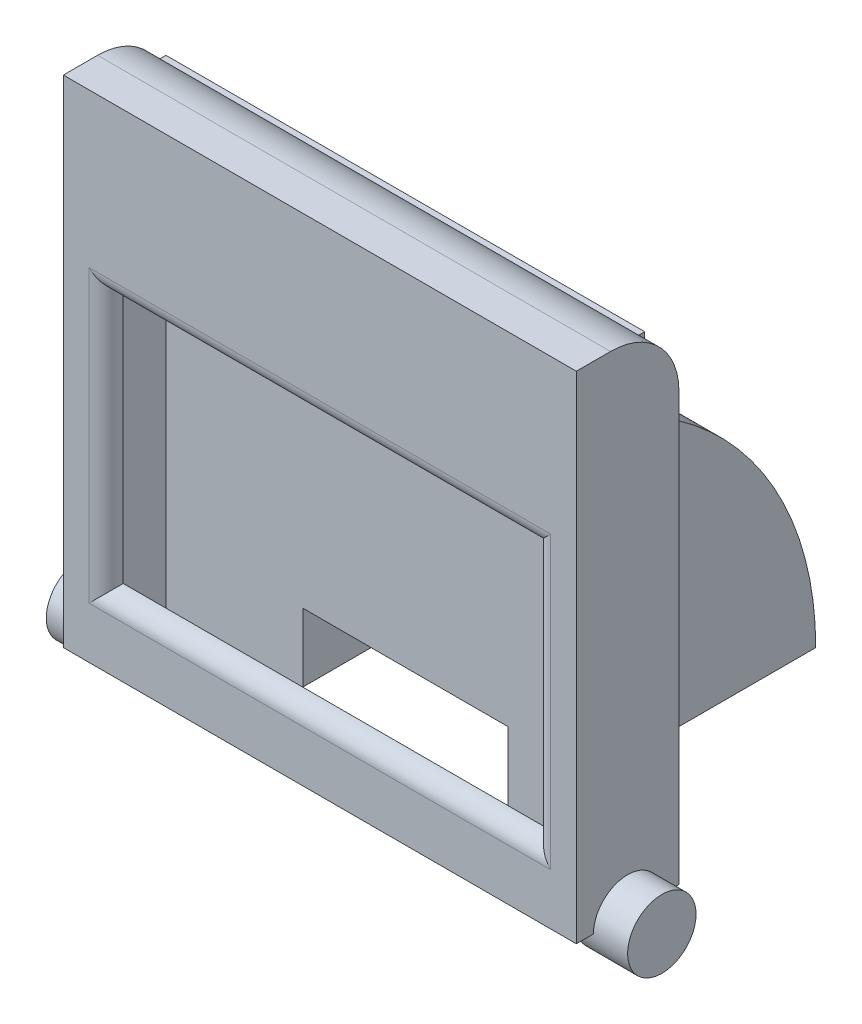
ISO-10303-21;
HEADER;
FILE_DESCRIPTION(('STEP AP214'),'2;1');
FILE_NAME('part.step','',(''),(''),'','','');
FILE_SCHEMA(('AUTOMOTIVE_DESIGN { 1 0 10303 214 1 1 1 1 }'));
ENDSEC;
DATA;
#1=APPLICATION_CONTEXT('core data for automotive mechanical design processes');
#2=APPLICATION_PROTOCOL_DEFINITION('international standard','automotive_design',2000,#1);
#3=PRODUCT_CONTEXT('',#1,'mechanical');
#4=PRODUCT('Part','Part','',(#3));
#5=PRODUCT_RELATED_PRODUCT_CATEGORY('part','',(#4));
#6=PRODUCT_DEFINITION_FORMATION('','',#4);
#7=PRODUCT_DEFINITION_CONTEXT('part definition',#1,'design');
#8=PRODUCT_DEFINITION('design','',#6,#7);
#9=PRODUCT_DEFINITION_SHAPE('','',#8);
#10=(LENGTH_UNIT() NAMED_UNIT(*) SI_UNIT(.MILLI.,.METRE.));
#11=(NAMED_UNIT(*) PLANE_ANGLE_UNIT() SI_UNIT($,.RADIAN.));
#12=(NAMED_UNIT(*) SI_UNIT($,.STERADIAN.) SOLID_ANGLE_UNIT());
#13=UNCERTAINTY_MEASURE_WITH_UNIT(LENGTH_MEASURE(1.E-05),#10,'distance_accuracy_value','');
#14=(GEOMETRIC_REPRESENTATION_CONTEXT(3) GLOBAL_UNCERTAINTY_ASSIGNED_CONTEXT((#13)) GLOBAL_UNIT_ASSIGNED_CONTEXT((#10,
#11,#12)) REPRESENTATION_CONTEXT('',''));
#15=CARTESIAN_POINT('',(0.,0.,0.));
#16=DIRECTION('',(0.,0.,1.));
#17=DIRECTION('',(1.,0.,0.));
#18=AXIS2_PLACEMENT_3D('',#15,#16,#17);
#19=CARTESIAN_POINT('',(0.,0.,4.));
#20=DIRECTION('',(0.,1.,0.));
#21=DIRECTION('',(0.,0.,1.));
#22=AXIS2_PLACEMENT_3D('',#19,#20,#21);
#23=PLANE('',#22);
#24=DIRECTION('',(1.,0.,0.));
#25=VECTOR('',#24,1.);
#26=CARTESIAN_POINT('',(0.,0.,0.));
#27=LINE('',#26,#25);
#28=CARTESIAN_POINT('',(0.,0.,0.));
#29=VERTEX_POINT('',#28);
#30=CARTESIAN_POINT('',(8.,0.,0.));
#31=VERTEX_POINT('',#30);
#32=EDGE_CURVE('E228',#29,#31,#27,.T.);
#33=ORIENTED_EDGE('',*,*,#32,.F.);
#34=DIRECTION('',(-1.,0.,0.));
#35=VECTOR('',#34,1.);
#36=CARTESIAN_POINT('',(0.,0.,0.));
#37=LINE('',#36,#35);
#38=CARTESIAN_POINT('',(-1.,0.,0.));
#39=VERTEX_POINT('',#38);
#40=EDGE_CURVE('E187',#29,#39,#37,.T.);
#41=ORIENTED_EDGE('',*,*,#40,.T.);
#42=DIRECTION('',(0.,0.,-1.));
#43=VECTOR('',#42,1.);
#44=CARTESIAN_POINT('',(-1.,0.,4.));
#45=LINE('',#44,#43);
#46=CARTESIAN_POINT('',(-1.,0.,-1.));
#47=VERTEX_POINT('',#46);
#48=EDGE_CURVE('E263',#39,#47,#45,.T.);
#49=ORIENTED_EDGE('',*,*,#48,.T.);
#50=DIRECTION('',(1.,0.,0.));
#51=VECTOR('',#50,1.);
#52=CARTESIAN_POINT('',(0.,0.,-1.));
#53=LINE('',#52,#51);
#54=CARTESIAN_POINT('',(7.,0.,-1.));
#55=VERTEX_POINT('',#54);
#56=EDGE_CURVE('E259',#47,#55,#53,.T.);
#57=ORIENTED_EDGE('',*,*,#56,.T.);
#58=DIRECTION('',(0.,0.,-1.));
#59=VECTOR('',#58,1.);
#60=CARTESIAN_POINT('',(7.,0.,-1.));
#61=LINE('',#60,#59);
#62=CARTESIAN_POINT('',(7.,0.,-17.));
#63=VERTEX_POINT('',#62);
#64=EDGE_CURVE('E370',#55,#63,#61,.T.);
#65=ORIENTED_EDGE('',*,*,#64,.T.);
#66=DIRECTION('',(-1.,0.,0.));
#67=VECTOR('',#66,1.);
#68=CARTESIAN_POINT('',(21.,0.,-17.));
#69=LINE('',#68,#67);
#70=CARTESIAN_POINT('',(21.,0.,-17.));
#71=VERTEX_POINT('',#70);
#72=EDGE_CURVE('E375',#71,#63,#69,.T.);
#73=ORIENTED_EDGE('',*,*,#72,.F.);
#74=DIRECTION('',(0.,0.,-1.));
#75=VECTOR('',#74,1.);
#76=CARTESIAN_POINT('',(21.,0.,-1.));
#77=LINE('',#76,#75);
#78=CARTESIAN_POINT('',(21.,0.,-1.));
#79=VERTEX_POINT('',#78);
#80=EDGE_CURVE('E362',#79,#71,#77,.T.);
#81=ORIENTED_EDGE('',*,*,#80,.F.);
#82=CARTESIAN_POINT('',(29.,0.,-1.));
#83=VERTEX_POINT('',#82);
#84=EDGE_CURVE('E241',#79,#83,#53,.T.);
#85=ORIENTED_EDGE('',*,*,#84,.T.);
#86=DIRECTION('',(0.,0.,-1.));
#87=VECTOR('',#86,1.);
#88=CARTESIAN_POINT('',(29.,0.,4.));
#89=LINE('',#88,#87);
#90=CARTESIAN_POINT('',(29.,0.,0.));
#91=VERTEX_POINT('',#90);
#92=EDGE_CURVE('E256',#91,#83,#89,.T.);
#93=ORIENTED_EDGE('',*,*,#92,.F.);
#94=DIRECTION('',(1.,0.,0.));
#95=VECTOR('',#94,1.);
#96=CARTESIAN_POINT('',(28.,0.,0.));
#97=LINE('',#96,#95);
#98=CARTESIAN_POINT('',(28.,0.,0.));
#99=VERTEX_POINT('',#98);
#100=EDGE_CURVE('E60',#91,#99,#97,.F.);
#101=ORIENTED_EDGE('',*,*,#100,.T.);
#102=CARTESIAN_POINT('',(20.,0.,0.));
#103=VERTEX_POINT('',#102);
#104=EDGE_CURVE('E226',#103,#99,#27,.T.);
#105=ORIENTED_EDGE('',*,*,#104,.F.);
#106=DIRECTION('',(0.,0.,-1.));
#107=VECTOR('',#106,1.);
#108=CARTESIAN_POINT('',(20.,0.,5.001));
#109=LINE('',#108,#107);
#110=CARTESIAN_POINT('',(20.,0.,-16.));
#111=VERTEX_POINT('',#110);
#112=EDGE_CURVE('E386',#103,#111,#109,.T.);
#113=ORIENTED_EDGE('',*,*,#112,.T.);
#114=DIRECTION('',(1.,0.,0.));
#115=VECTOR('',#114,1.);
#116=CARTESIAN_POINT('',(8.,0.,-16.));
#117=LINE('',#116,#115);
#118=CARTESIAN_POINT('',(8.,0.,-16.));
#119=VERTEX_POINT('',#118);
#120=EDGE_CURVE('E346',#119,#111,#117,.T.);
#121=ORIENTED_EDGE('',*,*,#120,.F.);
#122=DIRECTION('',(0.,0.,-1.));
#123=VECTOR('',#122,1.);
#124=CARTESIAN_POINT('',(8.,0.,5.001));
#125=LINE('',#124,#123);
#126=EDGE_CURVE('E390',#31,#119,#125,.T.);
#127=ORIENTED_EDGE('',*,*,#126,.F.);
#128=EDGE_LOOP('',(#33,#41,#49,#57,#65,#73,#81,#85,#93,#101,#105,#113,#121,#127));
#129=FACE_BOUND('',#128,.T.);
#130=ADVANCED_FACE('F35',(#129),#23,.F.);
#131=CARTESIAN_POINT('',(-1.,0.,5.));
#132=VERTEX_POINT('',#131);
#133=CARTESIAN_POINT('',(-1.,0.,4.));
#134=VERTEX_POINT('',#133);
#135=EDGE_CURVE('E203',#132,#134,#45,.T.);
#136=ORIENTED_EDGE('',*,*,#135,.T.);
#137=DIRECTION('',(-1.,0.,0.));
#138=VECTOR('',#137,1.);
#139=CARTESIAN_POINT('',(0.,0.,4.));
#140=LINE('',#139,#138);
#141=CARTESIAN_POINT('',(0.,0.,4.));
#142=VERTEX_POINT('',#141);
#143=EDGE_CURVE('E52',#134,#142,#140,.F.);
#144=ORIENTED_EDGE('',*,*,#143,.T.);
#145=DIRECTION('',(1.,0.,0.));
#146=VECTOR('',#145,1.);
#147=CARTESIAN_POINT('',(0.,0.,4.));
#148=LINE('',#147,#146);
#149=CARTESIAN_POINT('',(28.,0.,4.));
#150=VERTEX_POINT('',#149);
#151=EDGE_CURVE('E201',#142,#150,#148,.T.);
#152=ORIENTED_EDGE('',*,*,#151,.T.);
#153=DIRECTION('',(1.,0.,0.));
#154=VECTOR('',#153,1.);
#155=CARTESIAN_POINT('',(28.,0.,4.));
#156=LINE('',#155,#154);
#157=CARTESIAN_POINT('',(29.,0.,4.));
#158=VERTEX_POINT('',#157);
#159=EDGE_CURVE('E344',#150,#158,#156,.T.);
#160=ORIENTED_EDGE('',*,*,#159,.T.);
#161=CARTESIAN_POINT('',(29.,0.,5.));
#162=VERTEX_POINT('',#161);
#163=EDGE_CURVE('E266',#162,#158,#89,.T.);
#164=ORIENTED_EDGE('',*,*,#163,.F.);
#165=DIRECTION('',(1.,0.,0.));
#166=VECTOR('',#165,1.);
#167=CARTESIAN_POINT('',(0.,0.,5.));
#168=LINE('',#167,#166);
#169=EDGE_CURVE('E245',#132,#162,#168,.T.);
#170=ORIENTED_EDGE('',*,*,#169,.F.);
#171=EDGE_LOOP('',(#136,#144,#152,#160,#164,#170));
#172=FACE_BOUND('',#171,.T.);
#173=ADVANCED_FACE('F198',(#172),#23,.F.);
#174=CARTESIAN_POINT('',(-1.,0.,4.));
#175=DIRECTION('',(1.,0.,0.));
#176=DIRECTION('',(0.,0.,-1.));
#177=AXIS2_PLACEMENT_3D('',#174,#175,#176);
#178=PLANE('',#177);
#179=ORIENTED_EDGE('',*,*,#48,.F.);
#180=CARTESIAN_POINT('',(-1.,0.,2.));
#181=DIRECTION('',(1.,0.,0.));
#182=DIRECTION('',(0.,0.,-1.));
#183=AXIS2_PLACEMENT_3D('',#180,#181,#182);
#184=CIRCLE('',#183,2.);
#185=EDGE_CURVE('E192',#39,#134,#184,.T.);
#186=ORIENTED_EDGE('',*,*,#185,.T.);
#187=ORIENTED_EDGE('',*,*,#135,.F.);
#188=DIRECTION('',(0.,-1.,0.));
#189=VECTOR('',#188,1.);
#190=CARTESIAN_POINT('',(-1.,0.,5.));
#191=LINE('',#190,#189);
#192=CARTESIAN_POINT('',(-1.,29.,5.));
#193=VERTEX_POINT('',#192);
#194=EDGE_CURVE('E242',#193,#132,#191,.T.);
#195=ORIENTED_EDGE('',*,*,#194,.F.);
#196=DIRECTION('',(0.,0.,-1.));
#197=VECTOR('',#196,1.);
#198=CARTESIAN_POINT('',(-1.,29.,4.));
#199=LINE('',#198,#197);
#200=CARTESIAN_POINT('',(-1.,29.,3.));
#201=VERTEX_POINT('',#200);
#202=EDGE_CURVE('E247',#193,#201,#199,.T.);
#203=ORIENTED_EDGE('',*,*,#202,.T.);
#204=CARTESIAN_POINT('',(-1.,25.,3.));
#205=DIRECTION('',(1.,0.,0.));
#206=DIRECTION('',(0.,0.,-1.));
#207=AXIS2_PLACEMENT_3D('',#204,#205,#206);
#208=CIRCLE('',#207,4.);
#209=CARTESIAN_POINT('',(-1.,25.,-1.));
#210=VERTEX_POINT('',#209);
#211=EDGE_CURVE('E272',#201,#210,#208,.F.);
#212=ORIENTED_EDGE('',*,*,#211,.T.);
#213=DIRECTION('',(0.,-1.,0.));
#214=VECTOR('',#213,1.);
#215=CARTESIAN_POINT('',(-1.,0.,-1.));
#216=LINE('',#215,#214);
#217=EDGE_CURVE('E238',#210,#47,#216,.T.);
#218=ORIENTED_EDGE('',*,*,#217,.T.);
#219=EDGE_LOOP('',(#179,#186,#187,#195,#203,#212,#218));
#220=FACE_BOUND('',#219,.T.);
#221=ADVANCED_FACE('F331',(#220),#178,.F.);
#222=CARTESIAN_POINT('',(29.,0.,4.));
#223=DIRECTION('',(-1.,0.,0.));
#224=DIRECTION('',(0.,0.,1.));
#225=AXIS2_PLACEMENT_3D('',#222,#223,#224);
#226=PLANE('',#225);
#227=ORIENTED_EDGE('',*,*,#163,.T.);
#228=CARTESIAN_POINT('',(29.,0.,2.));
#229=DIRECTION('',(-1.,0.,0.));
#230=DIRECTION('',(0.,0.,1.));
#231=AXIS2_PLACEMENT_3D('',#228,#229,#230);
#232=CIRCLE('',#231,2.);
#233=EDGE_CURVE('E341',#158,#91,#232,.T.);
#234=ORIENTED_EDGE('',*,*,#233,.T.);
#235=ORIENTED_EDGE('',*,*,#92,.T.);
#236=DIRECTION('',(0.,1.,0.));
#237=VECTOR('',#236,1.);
#238=CARTESIAN_POINT('',(29.,0.,-1.));
#239=LINE('',#238,#237);
#240=CARTESIAN_POINT('',(29.,25.,-1.));
#241=VERTEX_POINT('',#240);
#242=EDGE_CURVE('E246',#83,#241,#239,.T.);
#243=ORIENTED_EDGE('',*,*,#242,.T.);
#244=CARTESIAN_POINT('',(29.,25.,3.));
#245=DIRECTION('',(-1.,0.,0.));
#246=DIRECTION('',(0.,0.,1.));
#247=AXIS2_PLACEMENT_3D('',#244,#245,#246);
#248=CIRCLE('',#247,4.);
#249=CARTESIAN_POINT('',(29.,29.,3.));
#250=VERTEX_POINT('',#249);
#251=EDGE_CURVE('E276',#241,#250,#248,.F.);
#252=ORIENTED_EDGE('',*,*,#251,.T.);
#253=DIRECTION('',(0.,0.,-1.));
#254=VECTOR('',#253,1.);
#255=CARTESIAN_POINT('',(29.,29.,4.));
#256=LINE('',#255,#254);
#257=CARTESIAN_POINT('',(29.,29.,5.));
#258=VERTEX_POINT('',#257);
#259=EDGE_CURVE('E250',#258,#250,#256,.T.);
#260=ORIENTED_EDGE('',*,*,#259,.F.);
#261=DIRECTION('',(0.,1.,0.));
#262=VECTOR('',#261,1.);
#263=CARTESIAN_POINT('',(29.,0.,5.));
#264=LINE('',#263,#262);
#265=EDGE_CURVE('E253',#162,#258,#264,.T.);
#266=ORIENTED_EDGE('',*,*,#265,.F.);
#267=EDGE_LOOP('',(#227,#234,#235,#243,#252,#260,#266));
#268=FACE_BOUND('',#267,.T.);
#269=ADVANCED_FACE('F444',(#268),#226,.F.);
#270=CARTESIAN_POINT('',(0.,29.,4.));
#271=DIRECTION('',(0.,-1.,0.));
#272=DIRECTION('',(0.,0.,-1.));
#273=AXIS2_PLACEMENT_3D('',#270,#271,#272);
#274=PLANE('',#273);
#275=ORIENTED_EDGE('',*,*,#259,.T.);
#276=DIRECTION('',(-1.,0.,0.));
#277=VECTOR('',#276,1.);
#278=CARTESIAN_POINT('',(-1.,29.,3.));
#279=LINE('',#278,#277);
#280=EDGE_CURVE('E262',#250,#201,#279,.T.);
#281=ORIENTED_EDGE('',*,*,#280,.T.);
#282=ORIENTED_EDGE('',*,*,#202,.F.);
#283=DIRECTION('',(-1.,0.,0.));
#284=VECTOR('',#283,1.);
#285=CARTESIAN_POINT('',(0.,29.,5.));
#286=LINE('',#285,#284);
#287=EDGE_CURVE('E251',#258,#193,#286,.T.);
#288=ORIENTED_EDGE('',*,*,#287,.F.);
#289=EDGE_LOOP('',(#275,#281,#282,#288));
#290=FACE_BOUND('',#289,.T.);
#291=ADVANCED_FACE('F323',(#290),#274,.F.);
#292=CARTESIAN_POINT('',(0.,0.,5.));
#293=DIRECTION('',(0.,0.,-1.));
#294=DIRECTION('',(-1.,0.,0.));
#295=AXIS2_PLACEMENT_3D('',#292,#293,#294);
#296=PLANE('',#295);
#297=DIRECTION('',(-1.,0.,0.));
#298=VECTOR('',#297,1.);
#299=CARTESIAN_POINT('',(0.,20.,5.));
#300=LINE('',#299,#298);
#301=CARTESIAN_POINT('',(0.499999999999998,20.,5.));
#302=VERTEX_POINT('',#301);
#303=CARTESIAN_POINT('',(27.5,20.,5.));
#304=VERTEX_POINT('',#303);
#305=EDGE_CURVE('E44',#302,#304,#300,.F.);
#306=ORIENTED_EDGE('',*,*,#305,.T.);
#307=DIRECTION('',(0.,1.,0.));
#308=VECTOR('',#307,1.);
#309=CARTESIAN_POINT('',(27.5,0.,5.));
#310=LINE('',#309,#308);
#311=CARTESIAN_POINT('',(27.5,3.,5.));
#312=VERTEX_POINT('',#311);
#313=EDGE_CURVE('E11',#304,#312,#310,.F.);
#314=ORIENTED_EDGE('',*,*,#313,.T.);
#315=DIRECTION('',(1.,0.,0.));
#316=VECTOR('',#315,1.);
#317=CARTESIAN_POINT('',(0.,3.,5.));
#318=LINE('',#317,#316);
#319=CARTESIAN_POINT('',(0.5,3.,5.));
#320=VERTEX_POINT('',#319);
#321=EDGE_CURVE('E278',#312,#320,#318,.F.);
#322=ORIENTED_EDGE('',*,*,#321,.T.);
#323=DIRECTION('',(0.,-1.,0.));
#324=VECTOR('',#323,1.);
#325=CARTESIAN_POINT('',(0.500000000000001,0.,5.));
#326=LINE('',#325,#324);
#327=EDGE_CURVE('E280',#320,#302,#326,.F.);
#328=ORIENTED_EDGE('',*,*,#327,.T.);
#329=EDGE_LOOP('',(#306,#314,#322,#328));
#330=FACE_BOUND('',#329,.T.);
#331=ORIENTED_EDGE('',*,*,#194,.T.);
#332=ORIENTED_EDGE('',*,*,#169,.T.);
#333=ORIENTED_EDGE('',*,*,#265,.T.);
#334=ORIENTED_EDGE('',*,*,#287,.T.);
#335=EDGE_LOOP('',(#331,#332,#333,#334));
#336=FACE_BOUND('',#335,.T.);
#337=ADVANCED_FACE('F319',(#330,#336),#296,.F.);
#338=CARTESIAN_POINT('',(0.,0.,-1.));
#339=DIRECTION('',(0.,0.,-1.));
#340=DIRECTION('',(-1.,0.,0.));
#341=AXIS2_PLACEMENT_3D('',#338,#339,#340);
#342=PLANE('',#341);
#343=DIRECTION('',(0.,-1.,0.));
#344=VECTOR('',#343,1.);
#345=CARTESIAN_POINT('',(21.,18.7616630392937,-1.));
#346=LINE('',#345,#344);
#347=CARTESIAN_POINT('',(21.,18.7616630392937,-1.));
#348=VERTEX_POINT('',#347);
#349=EDGE_CURVE('E359',#348,#79,#346,.T.);
#350=ORIENTED_EDGE('',*,*,#349,.F.);
#351=DIRECTION('',(-1.,0.,0.));
#352=VECTOR('',#351,1.);
#353=CARTESIAN_POINT('',(21.,18.7616630392937,-1.));
#354=LINE('',#353,#352);
#355=CARTESIAN_POINT('',(7.,18.7616630392937,-1.));
#356=VERTEX_POINT('',#355);
#357=EDGE_CURVE('E367',#348,#356,#354,.T.);
#358=ORIENTED_EDGE('',*,*,#357,.T.);
#359=DIRECTION('',(0.,-1.,0.));
#360=VECTOR('',#359,1.);
#361=CARTESIAN_POINT('',(7.,18.7616630392937,-1.));
#362=LINE('',#361,#360);
#363=EDGE_CURVE('E356',#356,#55,#362,.T.);
#364=ORIENTED_EDGE('',*,*,#363,.T.);
#365=ORIENTED_EDGE('',*,*,#56,.F.);
#366=ORIENTED_EDGE('',*,*,#217,.F.);
#367=DIRECTION('',(-1.,0.,0.));
#368=VECTOR('',#367,1.);
#369=CARTESIAN_POINT('',(29.,25.,-1.));
#370=LINE('',#369,#368);
#371=EDGE_CURVE('E274',#210,#241,#370,.F.);
#372=ORIENTED_EDGE('',*,*,#371,.T.);
#373=ORIENTED_EDGE('',*,*,#242,.F.);
#374=ORIENTED_EDGE('',*,*,#84,.F.);
#375=EDGE_LOOP('',(#350,#358,#364,#365,#366,#372,#373,#374));
#376=FACE_BOUND('',#375,.T.);
#377=ADVANCED_FACE('F322',(#376),#342,.T.);
#378=CARTESIAN_POINT('',(0.,0.,4.));
#379=DIRECTION('',(1.,0.,0.));
#380=DIRECTION('',(0.,0.,-1.));
#381=AXIS2_PLACEMENT_3D('',#378,#379,#380);
#382=PLANE('',#381);
#383=DIRECTION('',(0.,-1.,0.));
#384=VECTOR('',#383,1.);
#385=CARTESIAN_POINT('',(0.,0.,4.));
#386=LINE('',#385,#384);
#387=CARTESIAN_POINT('',(0.,28.,4.));
#388=VERTEX_POINT('',#387);
#389=EDGE_CURVE('E207',#388,#142,#386,.T.);
#390=ORIENTED_EDGE('',*,*,#389,.T.);
#391=CARTESIAN_POINT('',(0.,0.,2.));
#392=DIRECTION('',(-1.,0.,0.));
#393=DIRECTION('',(0.,0.,1.));
#394=AXIS2_PLACEMENT_3D('',#391,#392,#393);
#395=CIRCLE('',#394,2.);
#396=EDGE_CURVE('E184',#29,#142,#395,.T.);
#397=ORIENTED_EDGE('',*,*,#396,.F.);
#398=DIRECTION('',(0.,-1.,0.));
#399=VECTOR('',#398,1.);
#400=CARTESIAN_POINT('',(0.,0.,0.));
#401=LINE('',#400,#399);
#402=CARTESIAN_POINT('',(0.,28.,0.));
#403=VERTEX_POINT('',#402);
#404=EDGE_CURVE('E224',#403,#29,#401,.T.);
#405=ORIENTED_EDGE('',*,*,#404,.F.);
#406=DIRECTION('',(0.,0.,-1.));
#407=VECTOR('',#406,1.);
#408=CARTESIAN_POINT('',(0.,28.,4.));
#409=LINE('',#408,#407);
#410=EDGE_CURVE('E210',#388,#403,#409,.T.);
#411=ORIENTED_EDGE('',*,*,#410,.F.);
#412=EDGE_LOOP('',(#390,#397,#405,#411));
#413=FACE_BOUND('',#412,.T.);
#414=ADVANCED_FACE('F208',(#413),#382,.T.);
#415=CARTESIAN_POINT('',(28.,0.,4.));
#416=DIRECTION('',(-1.,0.,0.));
#417=DIRECTION('',(0.,0.,1.));
#418=AXIS2_PLACEMENT_3D('',#415,#416,#417);
#419=PLANE('',#418);
#420=DIRECTION('',(0.,1.,0.));
#421=VECTOR('',#420,1.);
#422=CARTESIAN_POINT('',(28.,0.,0.));
#423=LINE('',#422,#421);
#424=CARTESIAN_POINT('',(28.,28.,0.));
#425=VERTEX_POINT('',#424);
#426=EDGE_CURVE('E231',#99,#425,#423,.T.);
#427=ORIENTED_EDGE('',*,*,#426,.F.);
#428=CARTESIAN_POINT('',(28.,0.,2.));
#429=DIRECTION('',(1.,0.,0.));
#430=DIRECTION('',(0.,0.,-1.));
#431=AXIS2_PLACEMENT_3D('',#428,#429,#430);
#432=CIRCLE('',#431,2.);
#433=EDGE_CURVE('E339',#150,#99,#432,.T.);
#434=ORIENTED_EDGE('',*,*,#433,.F.);
#435=DIRECTION('',(0.,1.,0.));
#436=VECTOR('',#435,1.);
#437=CARTESIAN_POINT('',(28.,0.,4.));
#438=LINE('',#437,#436);
#439=CARTESIAN_POINT('',(28.,28.,4.));
#440=VERTEX_POINT('',#439);
#441=EDGE_CURVE('E217',#150,#440,#438,.T.);
#442=ORIENTED_EDGE('',*,*,#441,.T.);
#443=DIRECTION('',(0.,0.,-1.));
#444=VECTOR('',#443,1.);
#445=CARTESIAN_POINT('',(28.,28.,4.));
#446=LINE('',#445,#444);
#447=EDGE_CURVE('E235',#440,#425,#446,.T.);
#448=ORIENTED_EDGE('',*,*,#447,.T.);
#449=EDGE_LOOP('',(#427,#434,#442,#448));
#450=FACE_BOUND('',#449,.T.);
#451=ADVANCED_FACE('F417',(#450),#419,.T.);
#452=CARTESIAN_POINT('',(0.,28.,4.));
#453=DIRECTION('',(0.,-1.,0.));
#454=DIRECTION('',(0.,0.,-1.));
#455=AXIS2_PLACEMENT_3D('',#452,#453,#454);
#456=PLANE('',#455);
#457=DIRECTION('',(-1.,0.,0.));
#458=VECTOR('',#457,1.);
#459=CARTESIAN_POINT('',(0.,28.,0.));
#460=LINE('',#459,#458);
#461=EDGE_CURVE('E213',#425,#403,#460,.T.);
#462=ORIENTED_EDGE('',*,*,#461,.F.);
#463=ORIENTED_EDGE('',*,*,#447,.F.);
#464=DIRECTION('',(-1.,0.,0.));
#465=VECTOR('',#464,1.);
#466=CARTESIAN_POINT('',(0.,28.,4.));
#467=LINE('',#466,#465);
#468=EDGE_CURVE('E219',#440,#388,#467,.T.);
#469=ORIENTED_EDGE('',*,*,#468,.T.);
#470=ORIENTED_EDGE('',*,*,#410,.T.);
#471=EDGE_LOOP('',(#462,#463,#469,#470));
#472=FACE_BOUND('',#471,.T.);
#473=ADVANCED_FACE('F415',(#472),#456,.T.);
#474=CARTESIAN_POINT('',(0.,0.,4.));
#475=DIRECTION('',(0.,0.,-1.));
#476=DIRECTION('',(-1.,0.,0.));
#477=AXIS2_PLACEMENT_3D('',#474,#475,#476);
#478=PLANE('',#477);
#479=DIRECTION('',(0.,-1.,0.));
#480=VECTOR('',#479,1.);
#481=CARTESIAN_POINT('',(1.5,19.,4.));
#482=LINE('',#481,#480);
#483=CARTESIAN_POINT('',(1.5,19.,4.));
#484=VERTEX_POINT('',#483);
#485=CARTESIAN_POINT('',(1.5,4.,4.));
#486=VERTEX_POINT('',#485);
#487=EDGE_CURVE('E294',#484,#486,#482,.T.);
#488=ORIENTED_EDGE('',*,*,#487,.T.);
#489=DIRECTION('',(1.,0.,0.));
#490=VECTOR('',#489,1.);
#491=CARTESIAN_POINT('',(1.5,4.,4.));
#492=LINE('',#491,#490);
#493=CARTESIAN_POINT('',(26.5,4.,4.));
#494=VERTEX_POINT('',#493);
#495=EDGE_CURVE('E227',#486,#494,#492,.T.);
#496=ORIENTED_EDGE('',*,*,#495,.T.);
#497=DIRECTION('',(0.,1.,0.));
#498=VECTOR('',#497,1.);
#499=CARTESIAN_POINT('',(26.5,19.,4.));
#500=LINE('',#499,#498);
#501=CARTESIAN_POINT('',(26.5,19.,4.));
#502=VERTEX_POINT('',#501);
#503=EDGE_CURVE('E303',#494,#502,#500,.T.);
#504=ORIENTED_EDGE('',*,*,#503,.T.);
#505=DIRECTION('',(-1.,0.,0.));
#506=VECTOR('',#505,1.);
#507=CARTESIAN_POINT('',(1.5,19.,4.));
#508=LINE('',#507,#506);
#509=EDGE_CURVE('E299',#502,#484,#508,.T.);
#510=ORIENTED_EDGE('',*,*,#509,.T.);
#511=EDGE_LOOP('',(#488,#496,#504,#510));
#512=FACE_BOUND('',#511,.T.);
#513=ORIENTED_EDGE('',*,*,#389,.F.);
#514=ORIENTED_EDGE('',*,*,#468,.F.);
#515=ORIENTED_EDGE('',*,*,#441,.F.);
#516=ORIENTED_EDGE('',*,*,#151,.F.);
#517=EDGE_LOOP('',(#513,#514,#515,#516));
#518=FACE_BOUND('',#517,.T.);
#519=ADVANCED_FACE('F216',(#512,#518),#478,.T.);
#520=CARTESIAN_POINT('',(0.,0.,0.));
#521=DIRECTION('',(0.,0.,-1.));
#522=DIRECTION('',(-1.,0.,0.));
#523=AXIS2_PLACEMENT_3D('',#520,#521,#522);
#524=PLANE('',#523);
#525=ORIENTED_EDGE('',*,*,#32,.T.);
#526=DIRECTION('',(0.,-1.,0.));
#527=VECTOR('',#526,1.);
#528=CARTESIAN_POINT('',(8.,0.,0.));
#529=LINE('',#528,#527);
#530=CARTESIAN_POINT('',(8.,4.,0.));
#531=VERTEX_POINT('',#530);
#532=EDGE_CURVE('E378',#531,#31,#529,.T.);
#533=ORIENTED_EDGE('',*,*,#532,.F.);
#534=DIRECTION('',(-1.,0.,0.));
#535=VECTOR('',#534,1.);
#536=CARTESIAN_POINT('',(20.,4.,0.));
#537=LINE('',#536,#535);
#538=CARTESIAN_POINT('',(20.,4.,0.));
#539=VERTEX_POINT('',#538);
#540=EDGE_CURVE('E380',#539,#531,#537,.T.);
#541=ORIENTED_EDGE('',*,*,#540,.F.);
#542=DIRECTION('',(0.,1.,0.));
#543=VECTOR('',#542,1.);
#544=CARTESIAN_POINT('',(20.,0.,0.));
#545=LINE('',#544,#543);
#546=EDGE_CURVE('E383',#103,#539,#545,.T.);
#547=ORIENTED_EDGE('',*,*,#546,.F.);
#548=ORIENTED_EDGE('',*,*,#104,.T.);
#549=ORIENTED_EDGE('',*,*,#426,.T.);
#550=ORIENTED_EDGE('',*,*,#461,.T.);
#551=ORIENTED_EDGE('',*,*,#404,.T.);
#552=EDGE_LOOP('',(#525,#533,#541,#547,#548,#549,#550,#551));
#553=FACE_BOUND('',#552,.T.);
#554=ADVANCED_FACE('F409',(#553),#524,.F.);
#555=CARTESIAN_POINT('',(0.,25.,3.));
#556=DIRECTION('',(1.,0.,0.));
#557=DIRECTION('',(0.,0.,-1.));
#558=AXIS2_PLACEMENT_3D('',#555,#556,#557);
#559=CYLINDRICAL_SURFACE('',#558,4.);
#560=ORIENTED_EDGE('',*,*,#251,.F.);
#561=ORIENTED_EDGE('',*,*,#371,.F.);
#562=ORIENTED_EDGE('',*,*,#211,.F.);
#563=ORIENTED_EDGE('',*,*,#280,.F.);
#564=EDGE_LOOP('',(#560,#561,#562,#563));
#565=FACE_BOUND('',#564,.T.);
#566=ADVANCED_FACE('F454',(#565),#559,.T.);
#567=CARTESIAN_POINT('',(0.499999999999998,19.,4.));
#568=DIRECTION('',(0.,-1.,0.));
#569=DIRECTION('',(1.,0.,0.));
#570=AXIS2_PLACEMENT_3D('',#567,#568,#569);
#571=CYLINDRICAL_SURFACE('',#570,1.);
#572=CARTESIAN_POINT('',(0.499999999999997,20.,4.));
#573=DIRECTION('',(-0.707106781186547,-0.707106781186548,0.));
#574=DIRECTION('',(-0.707106781186548,0.707106781186547,0.));
#575=AXIS2_PLACEMENT_3D('',#572,#573,#574);
#576=ELLIPSE('',#575,1.41421356237309,1.);
#577=EDGE_CURVE('E287',#302,#484,#576,.F.);
#578=ORIENTED_EDGE('',*,*,#577,.F.);
#579=ORIENTED_EDGE('',*,*,#327,.F.);
#580=CARTESIAN_POINT('',(0.5,3.,4.));
#581=DIRECTION('',(0.707106781186548,-0.707106781186547,0.));
#582=DIRECTION('',(-0.707106781186547,-0.707106781186548,0.));
#583=AXIS2_PLACEMENT_3D('',#580,#581,#582);
#584=ELLIPSE('',#583,1.41421356237309,1.);
#585=EDGE_CURVE('E39',#486,#320,#584,.T.);
#586=ORIENTED_EDGE('',*,*,#585,.F.);
#587=ORIENTED_EDGE('',*,*,#487,.F.);
#588=EDGE_LOOP('',(#578,#579,#586,#587));
#589=FACE_BOUND('',#588,.T.);
#590=ADVANCED_FACE('F37',(#589),#571,.T.);
#591=CARTESIAN_POINT('',(1.5,3.,4.));
#592=DIRECTION('',(1.,0.,0.));
#593=DIRECTION('',(0.,1.,0.));
#594=AXIS2_PLACEMENT_3D('',#591,#592,#593);
#595=CYLINDRICAL_SURFACE('',#594,1.);
#596=ORIENTED_EDGE('',*,*,#585,.T.);
#597=ORIENTED_EDGE('',*,*,#321,.F.);
#598=CARTESIAN_POINT('',(27.5,3.,4.));
#599=DIRECTION('',(0.707106781186547,0.707106781186548,0.));
#600=DIRECTION('',(-0.707106781186548,0.707106781186547,0.));
#601=AXIS2_PLACEMENT_3D('',#598,#599,#600);
#602=ELLIPSE('',#601,1.4142135623731,1.);
#603=EDGE_CURVE('E285',#494,#312,#602,.T.);
#604=ORIENTED_EDGE('',*,*,#603,.F.);
#605=ORIENTED_EDGE('',*,*,#495,.F.);
#606=EDGE_LOOP('',(#596,#597,#604,#605));
#607=FACE_BOUND('',#606,.T.);
#608=ADVANCED_FACE('F310',(#607),#595,.T.);
#609=CARTESIAN_POINT('',(1.5,20.,4.));
#610=DIRECTION('',(-1.,0.,0.));
#611=DIRECTION('',(0.,-1.,0.));
#612=AXIS2_PLACEMENT_3D('',#609,#610,#611);
#613=CYLINDRICAL_SURFACE('',#612,1.);
#614=ORIENTED_EDGE('',*,*,#577,.T.);
#615=ORIENTED_EDGE('',*,*,#509,.F.);
#616=CARTESIAN_POINT('',(27.5,20.,4.));
#617=DIRECTION('',(-0.707106781186548,0.707106781186547,0.));
#618=DIRECTION('',(0.707106781186547,0.707106781186548,0.));
#619=AXIS2_PLACEMENT_3D('',#616,#617,#618);
#620=ELLIPSE('',#619,1.41421356237309,1.);
#621=EDGE_CURVE('E283',#304,#502,#620,.F.);
#622=ORIENTED_EDGE('',*,*,#621,.F.);
#623=ORIENTED_EDGE('',*,*,#305,.F.);
#624=EDGE_LOOP('',(#614,#615,#622,#623));
#625=FACE_BOUND('',#624,.T.);
#626=ADVANCED_FACE('F315',(#625),#613,.T.);
#627=CARTESIAN_POINT('',(27.5,19.,4.));
#628=DIRECTION('',(0.,1.,0.));
#629=DIRECTION('',(-1.,0.,0.));
#630=AXIS2_PLACEMENT_3D('',#627,#628,#629);
#631=CYLINDRICAL_SURFACE('',#630,1.);
#632=ORIENTED_EDGE('',*,*,#603,.T.);
#633=ORIENTED_EDGE('',*,*,#313,.F.);
#634=ORIENTED_EDGE('',*,*,#621,.T.);
#635=ORIENTED_EDGE('',*,*,#503,.F.);
#636=EDGE_LOOP('',(#632,#633,#634,#635));
#637=FACE_BOUND('',#636,.T.);
#638=ADVANCED_FACE('F313',(#637),#631,.T.);
#639=CARTESIAN_POINT('',(8.,0.,5.001));
#640=DIRECTION('',(-1.,0.,0.));
#641=DIRECTION('',(0.,0.,1.));
#642=AXIS2_PLACEMENT_3D('',#639,#640,#641);
#643=PLANE('',#642);
#644=ORIENTED_EDGE('',*,*,#532,.T.);
#645=ORIENTED_EDGE('',*,*,#126,.T.);
#646=DIRECTION('',(0.,-1.,0.));
#647=VECTOR('',#646,1.);
#648=CARTESIAN_POINT('',(8.,4.,-16.));
#649=LINE('',#648,#647);
#650=CARTESIAN_POINT('',(8.,4.,-16.));
#651=VERTEX_POINT('',#650);
#652=EDGE_CURVE('E350',#651,#119,#649,.T.);
#653=ORIENTED_EDGE('',*,*,#652,.F.);
#654=DIRECTION('',(0.,0.,-1.));
#655=VECTOR('',#654,1.);
#656=CARTESIAN_POINT('',(8.,4.,5.001));
#657=LINE('',#656,#655);
#658=EDGE_CURVE('E388',#531,#651,#657,.T.);
#659=ORIENTED_EDGE('',*,*,#658,.F.);
#660=EDGE_LOOP('',(#644,#645,#653,#659));
#661=FACE_BOUND('',#660,.T.);
#662=ADVANCED_FACE('F406',(#661),#643,.F.);
#663=CARTESIAN_POINT('',(20.,4.,5.001));
#664=DIRECTION('',(0.,1.,0.));
#665=DIRECTION('',(-1.,0.,0.));
#666=AXIS2_PLACEMENT_3D('',#663,#664,#665);
#667=PLANE('',#666);
#668=ORIENTED_EDGE('',*,*,#540,.T.);
#669=ORIENTED_EDGE('',*,*,#658,.T.);
#670=DIRECTION('',(1.,0.,0.));
#671=VECTOR('',#670,1.);
#672=CARTESIAN_POINT('',(8.,4.,-16.));
#673=LINE('',#672,#671);
#674=CARTESIAN_POINT('',(20.,4.,-16.));
#675=VERTEX_POINT('',#674);
#676=EDGE_CURVE('E347',#651,#675,#673,.T.);
#677=ORIENTED_EDGE('',*,*,#676,.T.);
#678=DIRECTION('',(0.,0.,-1.));
#679=VECTOR('',#678,1.);
#680=CARTESIAN_POINT('',(20.,4.,5.001));
#681=LINE('',#680,#679);
#682=EDGE_CURVE('E286',#539,#675,#681,.T.);
#683=ORIENTED_EDGE('',*,*,#682,.F.);
#684=EDGE_LOOP('',(#668,#669,#677,#683));
#685=FACE_BOUND('',#684,.T.);
#686=ADVANCED_FACE('F423',(#685),#667,.F.);
#687=CARTESIAN_POINT('',(20.,0.,5.001));
#688=DIRECTION('',(1.,0.,0.));
#689=DIRECTION('',(0.,1.,0.));
#690=AXIS2_PLACEMENT_3D('',#687,#688,#689);
#691=PLANE('',#690);
#692=ORIENTED_EDGE('',*,*,#546,.T.);
#693=ORIENTED_EDGE('',*,*,#682,.T.);
#694=DIRECTION('',(0.,-1.,0.));
#695=VECTOR('',#694,1.);
#696=CARTESIAN_POINT('',(20.,4.,-16.));
#697=LINE('',#696,#695);
#698=EDGE_CURVE('E353',#675,#111,#697,.T.);
#699=ORIENTED_EDGE('',*,*,#698,.T.);
#700=ORIENTED_EDGE('',*,*,#112,.F.);
#701=EDGE_LOOP('',(#692,#693,#699,#700));
#702=FACE_BOUND('',#701,.T.);
#703=ADVANCED_FACE('F400',(#702),#691,.F.);
#704=CARTESIAN_POINT('',(21.,0.,2.));
#705=DIRECTION('',(-1.,0.,0.));
#706=DIRECTION('',(0.,0.,1.));
#707=AXIS2_PLACEMENT_3D('',#704,#705,#706);
#708=CYLINDRICAL_SURFACE('',#707,19.);
#709=CARTESIAN_POINT('',(7.,0.,2.));
#710=DIRECTION('',(1.,0.,0.));
#711=DIRECTION('',(0.,0.,-1.));
#712=AXIS2_PLACEMENT_3D('',#709,#710,#711);
#713=CIRCLE('',#712,19.);
#714=EDGE_CURVE('E363',#63,#356,#713,.T.);
#715=ORIENTED_EDGE('',*,*,#714,.T.);
#716=ORIENTED_EDGE('',*,*,#357,.F.);
#717=CARTESIAN_POINT('',(21.,0.,2.));
#718=DIRECTION('',(1.,0.,0.));
#719=DIRECTION('',(0.,0.,-1.));
#720=AXIS2_PLACEMENT_3D('',#717,#718,#719);
#721=CIRCLE('',#720,19.);
#722=EDGE_CURVE('E365',#71,#348,#721,.T.);
#723=ORIENTED_EDGE('',*,*,#722,.F.);
#724=ORIENTED_EDGE('',*,*,#72,.T.);
#725=EDGE_LOOP('',(#715,#716,#723,#724));
#726=FACE_BOUND('',#725,.T.);
#727=ADVANCED_FACE('F430',(#726),#708,.T.);
#728=CARTESIAN_POINT('',(21.,0.,2.));
#729=DIRECTION('',(1.,0.,0.));
#730=DIRECTION('',(0.,0.,-1.));
#731=AXIS2_PLACEMENT_3D('',#728,#729,#730);
#732=PLANE('',#731);
#733=ORIENTED_EDGE('',*,*,#349,.T.);
#734=ORIENTED_EDGE('',*,*,#80,.T.);
#735=ORIENTED_EDGE('',*,*,#722,.T.);
#736=EDGE_LOOP('',(#733,#734,#735));
#737=FACE_BOUND('',#736,.T.);
#738=ADVANCED_FACE('F570',(#737),#732,.T.);
#739=CARTESIAN_POINT('',(7.,0.,2.));
#740=DIRECTION('',(1.,0.,0.));
#741=DIRECTION('',(0.,0.,-1.));
#742=AXIS2_PLACEMENT_3D('',#739,#740,#741);
#743=PLANE('',#742);
#744=ORIENTED_EDGE('',*,*,#363,.F.);
#745=ORIENTED_EDGE('',*,*,#714,.F.);
#746=ORIENTED_EDGE('',*,*,#64,.F.);
#747=EDGE_LOOP('',(#744,#745,#746));
#748=FACE_BOUND('',#747,.T.);
#749=ADVANCED_FACE('F562',(#748),#743,.F.);
#750=CARTESIAN_POINT('',(8.,4.,-16.));
#751=DIRECTION('',(0.,0.,-1.));
#752=DIRECTION('',(-1.,0.,0.));
#753=AXIS2_PLACEMENT_3D('',#750,#751,#752);
#754=PLANE('',#753);
#755=ORIENTED_EDGE('',*,*,#120,.T.);
#756=ORIENTED_EDGE('',*,*,#698,.F.);
#757=ORIENTED_EDGE('',*,*,#676,.F.);
#758=ORIENTED_EDGE('',*,*,#652,.T.);
#759=EDGE_LOOP('',(#755,#756,#757,#758));
#760=FACE_BOUND('',#759,.T.);
#761=ADVANCED_FACE('F403',(#760),#754,.F.);
#762=CARTESIAN_POINT('',(28.,0.,2.));
#763=DIRECTION('',(1.,0.,0.));
#764=DIRECTION('',(0.,0.,-1.));
#765=AXIS2_PLACEMENT_3D('',#762,#763,#764);
#766=CYLINDRICAL_SURFACE('',#765,2.);
#767=CARTESIAN_POINT('',(31.,0.,2.));
#768=DIRECTION('',(1.,0.,0.));
#769=DIRECTION('',(0.,0.,-1.));
#770=AXIS2_PLACEMENT_3D('',#767,#768,#769);
#771=CIRCLE('',#770,2.);
#772=CARTESIAN_POINT('',(31.,0.,0.));
#773=VERTEX_POINT('',#772);
#774=EDGE_CURVE('E336',#773,#773,#771,.T.);
#775=ORIENTED_EDGE('',*,*,#774,.F.);
#776=EDGE_LOOP('',(#775));
#777=FACE_BOUND('',#776,.T.);
#778=ORIENTED_EDGE('',*,*,#159,.F.);
#779=ORIENTED_EDGE('',*,*,#433,.T.);
#780=ORIENTED_EDGE('',*,*,#100,.F.);
#781=ORIENTED_EDGE('',*,*,#233,.F.);
#782=EDGE_LOOP('',(#778,#779,#780,#781));
#783=FACE_BOUND('',#782,.T.);
#784=ADVANCED_FACE('F419',(#777,#783),#766,.T.);
#785=CARTESIAN_POINT('',(31.,0.,2.));
#786=DIRECTION('',(1.,0.,0.));
#787=DIRECTION('',(0.,0.,-1.));
#788=AXIS2_PLACEMENT_3D('',#785,#786,#787);
#789=PLANE('',#788);
#790=ORIENTED_EDGE('',*,*,#774,.T.);
#791=EDGE_LOOP('',(#790));
#792=FACE_BOUND('',#791,.T.);
#793=ADVANCED_FACE('F541',(#792),#789,.T.);
#794=CARTESIAN_POINT('',(0.,0.,2.));
#795=DIRECTION('',(-1.,0.,0.));
#796=DIRECTION('',(0.,0.,1.));
#797=AXIS2_PLACEMENT_3D('',#794,#795,#796);
#798=CYLINDRICAL_SURFACE('',#797,2.);
#799=CARTESIAN_POINT('',(-3.,0.,2.));
#800=DIRECTION('',(-1.,0.,0.));
#801=DIRECTION('',(0.,0.,1.));
#802=AXIS2_PLACEMENT_3D('',#799,#800,#801);
#803=CIRCLE('',#802,2.);
#804=CARTESIAN_POINT('',(-3.,0.,4.));
#805=VERTEX_POINT('',#804);
#806=EDGE_CURVE('E193',#805,#805,#803,.T.);
#807=ORIENTED_EDGE('',*,*,#806,.F.);
#808=EDGE_LOOP('',(#807));
#809=FACE_BOUND('',#808,.T.);
#810=ORIENTED_EDGE('',*,*,#40,.F.);
#811=ORIENTED_EDGE('',*,*,#396,.T.);
#812=ORIENTED_EDGE('',*,*,#143,.F.);
#813=ORIENTED_EDGE('',*,*,#185,.F.);
#814=EDGE_LOOP('',(#810,#811,#812,#813));
#815=FACE_BOUND('',#814,.T.);
#816=ADVANCED_FACE('F185',(#809,#815),#798,.T.);
#817=CARTESIAN_POINT('',(-3.,0.,2.));
#818=DIRECTION('',(-1.,0.,0.));
#819=DIRECTION('',(0.,0.,1.));
#820=AXIS2_PLACEMENT_3D('',#817,#818,#819);
#821=PLANE('',#820);
#822=ORIENTED_EDGE('',*,*,#806,.T.);
#823=EDGE_LOOP('',(#822));
#824=FACE_BOUND('',#823,.T.);
#825=ADVANCED_FACE('F655',(#824),#821,.T.);
#826=CLOSED_SHELL('',(#130,#173,#221,#269,#291,#337,#377,#414,#451,#473,#519,#554,#566,#590,
#608,#626,#638,#662,#686,#703,#727,#738,#749,#761,#784,#793,#816,#825));
#827=MANIFOLD_SOLID_BREP('B2',#826);
#828=ADVANCED_BREP_SHAPE_REPRESENTATION('',(#18,#827),#14);
#829=SHAPE_DEFINITION_REPRESENTATION(#9,#828);
ENDSEC;
END-ISO-10303-21;
